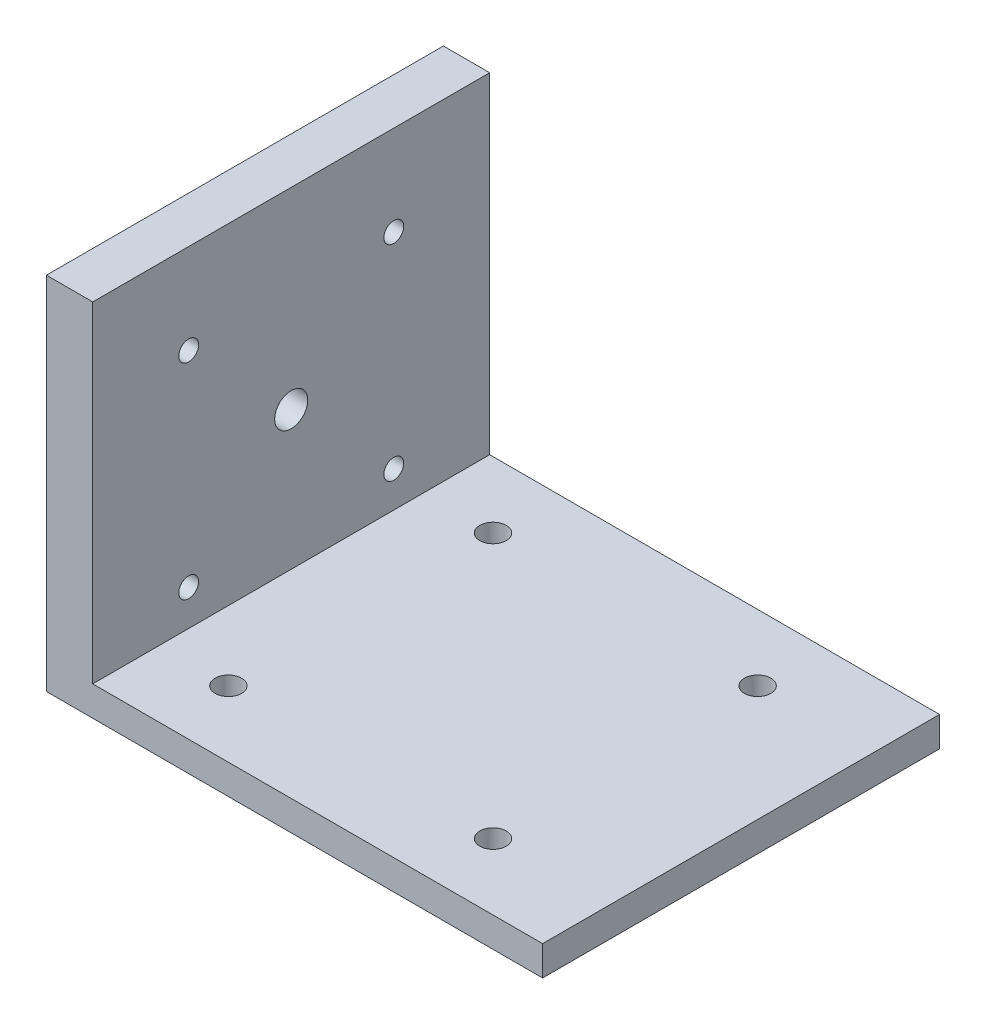
ISO-10303-21;
HEADER;
FILE_DESCRIPTION(('STEP AP214'),'2;1');
FILE_NAME('part.step','',(''),(''),'','','');
FILE_SCHEMA(('AUTOMOTIVE_DESIGN { 1 0 10303 214 1 1 1 1 }'));
ENDSEC;
DATA;
#1=APPLICATION_CONTEXT('core data for automotive mechanical design processes');
#2=APPLICATION_PROTOCOL_DEFINITION('international standard','automotive_design',2000,#1);
#3=PRODUCT_CONTEXT('',#1,'mechanical');
#4=PRODUCT('Part','Part','',(#3));
#5=PRODUCT_RELATED_PRODUCT_CATEGORY('part','',(#4));
#6=PRODUCT_DEFINITION_FORMATION('','',#4);
#7=PRODUCT_DEFINITION_CONTEXT('part definition',#1,'design');
#8=PRODUCT_DEFINITION('design','',#6,#7);
#9=PRODUCT_DEFINITION_SHAPE('','',#8);
#10=(LENGTH_UNIT() NAMED_UNIT(*) SI_UNIT(.MILLI.,.METRE.));
#11=(NAMED_UNIT(*) PLANE_ANGLE_UNIT() SI_UNIT($,.RADIAN.));
#12=(NAMED_UNIT(*) SI_UNIT($,.STERADIAN.) SOLID_ANGLE_UNIT());
#13=UNCERTAINTY_MEASURE_WITH_UNIT(LENGTH_MEASURE(1.E-05),#10,'distance_accuracy_value','');
#14=(GEOMETRIC_REPRESENTATION_CONTEXT(3) GLOBAL_UNCERTAINTY_ASSIGNED_CONTEXT((#13)) GLOBAL_UNIT_ASSIGNED_CONTEXT((#10,
#11,#12)) REPRESENTATION_CONTEXT('',''));
#15=CARTESIAN_POINT('',(0.,0.,0.));
#16=DIRECTION('',(0.,0.,1.));
#17=DIRECTION('',(1.,0.,0.));
#18=AXIS2_PLACEMENT_3D('',#15,#16,#17);
#19=CARTESIAN_POINT('',(37.5,4.5,-30.));
#20=DIRECTION('',(-1.,0.,0.));
#21=DIRECTION('',(0.,0.,1.));
#22=AXIS2_PLACEMENT_3D('',#19,#20,#21);
#23=PLANE('',#22);
#24=DIRECTION('',(0.,0.,-1.));
#25=VECTOR('',#24,1.);
#26=CARTESIAN_POINT('',(37.5,0.,-30.));
#27=LINE('',#26,#25);
#28=CARTESIAN_POINT('',(37.5,0.,30.));
#29=VERTEX_POINT('',#28);
#30=CARTESIAN_POINT('',(37.5,0.,-30.));
#31=VERTEX_POINT('',#30);
#32=EDGE_CURVE('E91',#29,#31,#27,.T.);
#33=ORIENTED_EDGE('',*,*,#32,.T.);
#34=DIRECTION('',(0.,-1.,0.));
#35=VECTOR('',#34,1.);
#36=CARTESIAN_POINT('',(37.5,4.5,-30.));
#37=LINE('',#36,#35);
#38=CARTESIAN_POINT('',(37.5,4.5,-30.));
#39=VERTEX_POINT('',#38);
#40=EDGE_CURVE('E11',#39,#31,#37,.T.);
#41=ORIENTED_EDGE('',*,*,#40,.F.);
#42=DIRECTION('',(0.,0.,-1.));
#43=VECTOR('',#42,1.);
#44=CARTESIAN_POINT('',(37.5,4.5,-30.));
#45=LINE('',#44,#43);
#46=CARTESIAN_POINT('',(37.5,4.5,30.));
#47=VERTEX_POINT('',#46);
#48=EDGE_CURVE('E85',#47,#39,#45,.T.);
#49=ORIENTED_EDGE('',*,*,#48,.F.);
#50=DIRECTION('',(0.,-1.,0.));
#51=VECTOR('',#50,1.);
#52=CARTESIAN_POINT('',(37.5,4.5,30.));
#53=LINE('',#52,#51);
#54=EDGE_CURVE('E77',#47,#29,#53,.T.);
#55=ORIENTED_EDGE('',*,*,#54,.T.);
#56=EDGE_LOOP('',(#33,#41,#49,#55));
#57=FACE_BOUND('',#56,.T.);
#58=ADVANCED_FACE('F33',(#57),#23,.F.);
#59=CARTESIAN_POINT('',(-37.5,4.5,-30.));
#60=DIRECTION('',(0.,0.,1.));
#61=DIRECTION('',(1.,0.,0.));
#62=AXIS2_PLACEMENT_3D('',#59,#60,#61);
#63=PLANE('',#62);
#64=DIRECTION('',(-1.,0.,0.));
#65=VECTOR('',#64,1.);
#66=CARTESIAN_POINT('',(-37.5,0.,-30.));
#67=LINE('',#66,#65);
#68=CARTESIAN_POINT('',(-37.5,0.,-30.));
#69=VERTEX_POINT('',#68);
#70=EDGE_CURVE('E94',#31,#69,#67,.T.);
#71=ORIENTED_EDGE('',*,*,#70,.T.);
#72=DIRECTION('',(0.,-1.,0.));
#73=VECTOR('',#72,1.);
#74=CARTESIAN_POINT('',(-37.5,4.5,-30.));
#75=LINE('',#74,#73);
#76=CARTESIAN_POINT('',(-37.5,54.5,-30.));
#77=VERTEX_POINT('',#76);
#78=EDGE_CURVE('E41',#77,#69,#75,.T.);
#79=ORIENTED_EDGE('',*,*,#78,.F.);
#80=DIRECTION('',(-1.,0.,0.));
#81=VECTOR('',#80,1.);
#82=CARTESIAN_POINT('',(-37.5,54.5,-30.));
#83=LINE('',#82,#81);
#84=CARTESIAN_POINT('',(-30.5,54.5,-30.));
#85=VERTEX_POINT('',#84);
#86=EDGE_CURVE('E154',#85,#77,#83,.T.);
#87=ORIENTED_EDGE('',*,*,#86,.F.);
#88=DIRECTION('',(0.,-1.,0.));
#89=VECTOR('',#88,1.);
#90=CARTESIAN_POINT('',(-30.5,54.5,-30.));
#91=LINE('',#90,#89);
#92=CARTESIAN_POINT('',(-30.5,4.5,-30.));
#93=VERTEX_POINT('',#92);
#94=EDGE_CURVE('E95',#85,#93,#91,.T.);
#95=ORIENTED_EDGE('',*,*,#94,.T.);
#96=DIRECTION('',(-1.,0.,0.));
#97=VECTOR('',#96,1.);
#98=CARTESIAN_POINT('',(-37.5,4.5,-30.));
#99=LINE('',#98,#97);
#100=EDGE_CURVE('E166',#39,#93,#99,.T.);
#101=ORIENTED_EDGE('',*,*,#100,.F.);
#102=ORIENTED_EDGE('',*,*,#40,.T.);
#103=EDGE_LOOP('',(#71,#79,#87,#95,#101,#102));
#104=FACE_BOUND('',#103,.T.);
#105=ADVANCED_FACE('F173',(#104),#63,.F.);
#106=CARTESIAN_POINT('',(-37.5,4.5,-30.));
#107=DIRECTION('',(1.,0.,0.));
#108=DIRECTION('',(0.,0.,-1.));
#109=AXIS2_PLACEMENT_3D('',#106,#107,#108);
#110=PLANE('',#109);
#111=CARTESIAN_POINT('',(-37.5,25.4,0.));
#112=DIRECTION('',(-1.,0.,0.));
#113=DIRECTION('',(0.,0.,1.));
#114=AXIS2_PLACEMENT_3D('',#111,#112,#113);
#115=CIRCLE('',#114,2.5);
#116=CARTESIAN_POINT('',(-37.5,25.4,2.5));
#117=VERTEX_POINT('',#116);
#118=EDGE_CURVE('E135',#117,#117,#115,.T.);
#119=ORIENTED_EDGE('',*,*,#118,.F.);
#120=EDGE_LOOP('',(#119));
#121=FACE_BOUND('',#120,.T.);
#122=CARTESIAN_POINT('',(-37.5,9.9,-15.5));
#123=DIRECTION('',(-1.,0.,0.));
#124=DIRECTION('',(0.,0.,-1.));
#125=AXIS2_PLACEMENT_3D('',#122,#123,#124);
#126=CIRCLE('',#125,1.5);
#127=CARTESIAN_POINT('',(-37.5,9.9,-17.));
#128=VERTEX_POINT('',#127);
#129=EDGE_CURVE('E139',#128,#128,#126,.T.);
#130=ORIENTED_EDGE('',*,*,#129,.F.);
#131=EDGE_LOOP('',(#130));
#132=FACE_BOUND('',#131,.T.);
#133=CARTESIAN_POINT('',(-37.5,9.90000000000003,15.5));
#134=DIRECTION('',(-1.,0.,0.));
#135=DIRECTION('',(0.,0.,1.));
#136=AXIS2_PLACEMENT_3D('',#133,#134,#135);
#137=CIRCLE('',#136,1.5);
#138=CARTESIAN_POINT('',(-37.5,9.90000000000003,17.));
#139=VERTEX_POINT('',#138);
#140=EDGE_CURVE('E144',#139,#139,#137,.T.);
#141=ORIENTED_EDGE('',*,*,#140,.F.);
#142=EDGE_LOOP('',(#141));
#143=FACE_BOUND('',#142,.T.);
#144=CARTESIAN_POINT('',(-37.5,40.9,15.5));
#145=DIRECTION('',(-1.,0.,0.));
#146=DIRECTION('',(0.,0.,-1.));
#147=AXIS2_PLACEMENT_3D('',#144,#145,#146);
#148=CIRCLE('',#147,1.5);
#149=CARTESIAN_POINT('',(-37.5,40.9,14.));
#150=VERTEX_POINT('',#149);
#151=EDGE_CURVE('E150',#150,#150,#148,.T.);
#152=ORIENTED_EDGE('',*,*,#151,.F.);
#153=EDGE_LOOP('',(#152));
#154=FACE_BOUND('',#153,.T.);
#155=CARTESIAN_POINT('',(-37.5,40.9,-15.5));
#156=DIRECTION('',(-1.,0.,0.));
#157=DIRECTION('',(0.,0.,1.));
#158=AXIS2_PLACEMENT_3D('',#155,#156,#157);
#159=CIRCLE('',#158,1.5);
#160=CARTESIAN_POINT('',(-37.5,40.9,-14.));
#161=VERTEX_POINT('',#160);
#162=EDGE_CURVE('E112',#161,#161,#159,.T.);
#163=ORIENTED_EDGE('',*,*,#162,.F.);
#164=EDGE_LOOP('',(#163));
#165=FACE_BOUND('',#164,.T.);
#166=DIRECTION('',(0.,0.,1.));
#167=VECTOR('',#166,1.);
#168=CARTESIAN_POINT('',(-37.5,0.,-30.));
#169=LINE('',#168,#167);
#170=CARTESIAN_POINT('',(-37.5,0.,30.));
#171=VERTEX_POINT('',#170);
#172=EDGE_CURVE('E86',#69,#171,#169,.T.);
#173=ORIENTED_EDGE('',*,*,#172,.T.);
#174=DIRECTION('',(0.,-1.,0.));
#175=VECTOR('',#174,1.);
#176=CARTESIAN_POINT('',(-37.5,4.5,30.));
#177=LINE('',#176,#175);
#178=CARTESIAN_POINT('',(-37.5,54.5,30.));
#179=VERTEX_POINT('',#178);
#180=EDGE_CURVE('E81',#179,#171,#177,.T.);
#181=ORIENTED_EDGE('',*,*,#180,.F.);
#182=DIRECTION('',(0.,0.,1.));
#183=VECTOR('',#182,1.);
#184=CARTESIAN_POINT('',(-37.5,54.5,-30.));
#185=LINE('',#184,#183);
#186=EDGE_CURVE('E157',#77,#179,#185,.T.);
#187=ORIENTED_EDGE('',*,*,#186,.F.);
#188=ORIENTED_EDGE('',*,*,#78,.T.);
#189=EDGE_LOOP('',(#173,#181,#187,#188));
#190=FACE_BOUND('',#189,.T.);
#191=ADVANCED_FACE('F189',(#121,#132,#143,#154,#165,#190),#110,.F.);
#192=CARTESIAN_POINT('',(-37.5,4.5,30.));
#193=DIRECTION('',(0.,0.,-1.));
#194=DIRECTION('',(-1.,0.,0.));
#195=AXIS2_PLACEMENT_3D('',#192,#193,#194);
#196=PLANE('',#195);
#197=DIRECTION('',(1.,0.,0.));
#198=VECTOR('',#197,1.);
#199=CARTESIAN_POINT('',(-37.5,0.,30.));
#200=LINE('',#199,#198);
#201=EDGE_CURVE('E74',#171,#29,#200,.T.);
#202=ORIENTED_EDGE('',*,*,#201,.T.);
#203=ORIENTED_EDGE('',*,*,#54,.F.);
#204=DIRECTION('',(1.,0.,0.));
#205=VECTOR('',#204,1.);
#206=CARTESIAN_POINT('',(-37.5,4.5,30.));
#207=LINE('',#206,#205);
#208=CARTESIAN_POINT('',(-30.5,4.5,30.));
#209=VERTEX_POINT('',#208);
#210=EDGE_CURVE('E54',#209,#47,#207,.T.);
#211=ORIENTED_EDGE('',*,*,#210,.F.);
#212=DIRECTION('',(0.,-1.,0.));
#213=VECTOR('',#212,1.);
#214=CARTESIAN_POINT('',(-30.5,54.5,30.));
#215=LINE('',#214,#213);
#216=CARTESIAN_POINT('',(-30.5,54.5,30.));
#217=VERTEX_POINT('',#216);
#218=EDGE_CURVE('E99',#217,#209,#215,.T.);
#219=ORIENTED_EDGE('',*,*,#218,.F.);
#220=DIRECTION('',(1.,0.,0.));
#221=VECTOR('',#220,1.);
#222=CARTESIAN_POINT('',(-37.5,54.5,30.));
#223=LINE('',#222,#221);
#224=EDGE_CURVE('E160',#179,#217,#223,.T.);
#225=ORIENTED_EDGE('',*,*,#224,.F.);
#226=ORIENTED_EDGE('',*,*,#180,.T.);
#227=EDGE_LOOP('',(#202,#203,#211,#219,#225,#226));
#228=FACE_BOUND('',#227,.T.);
#229=ADVANCED_FACE('F76',(#228),#196,.F.);
#230=CARTESIAN_POINT('',(0.,4.5,0.));
#231=DIRECTION('',(0.,1.,0.));
#232=DIRECTION('',(0.,0.,1.));
#233=AXIS2_PLACEMENT_3D('',#230,#231,#232);
#234=PLANE('',#233);
#235=CARTESIAN_POINT('',(-20.,4.5,-20.));
#236=DIRECTION('',(0.,1.,0.));
#237=DIRECTION('',(0.,0.,-1.));
#238=AXIS2_PLACEMENT_3D('',#235,#236,#237);
#239=CIRCLE('',#238,2.);
#240=CARTESIAN_POINT('',(-20.,4.5,-22.));
#241=VERTEX_POINT('',#240);
#242=EDGE_CURVE('E349',#241,#241,#239,.T.);
#243=ORIENTED_EDGE('',*,*,#242,.F.);
#244=EDGE_LOOP('',(#243));
#245=FACE_BOUND('',#244,.T.);
#246=CARTESIAN_POINT('',(20.,4.5,20.));
#247=DIRECTION('',(0.,1.,0.));
#248=DIRECTION('',(0.,0.,-1.));
#249=AXIS2_PLACEMENT_3D('',#246,#247,#248);
#250=CIRCLE('',#249,2.);
#251=CARTESIAN_POINT('',(20.,4.5,18.));
#252=VERTEX_POINT('',#251);
#253=EDGE_CURVE('E350',#252,#252,#250,.T.);
#254=ORIENTED_EDGE('',*,*,#253,.F.);
#255=EDGE_LOOP('',(#254));
#256=FACE_BOUND('',#255,.T.);
#257=CARTESIAN_POINT('',(-20.,4.5,20.));
#258=DIRECTION('',(0.,1.,0.));
#259=DIRECTION('',(0.,0.,1.));
#260=AXIS2_PLACEMENT_3D('',#257,#258,#259);
#261=CIRCLE('',#260,2.);
#262=CARTESIAN_POINT('',(-20.,4.5,22.));
#263=VERTEX_POINT('',#262);
#264=EDGE_CURVE('E355',#263,#263,#261,.T.);
#265=ORIENTED_EDGE('',*,*,#264,.F.);
#266=EDGE_LOOP('',(#265));
#267=FACE_BOUND('',#266,.T.);
#268=CARTESIAN_POINT('',(20.,4.5,-20.));
#269=DIRECTION('',(0.,1.,0.));
#270=DIRECTION('',(0.,0.,1.));
#271=AXIS2_PLACEMENT_3D('',#268,#269,#270);
#272=CIRCLE('',#271,2.);
#273=CARTESIAN_POINT('',(20.,4.5,-18.));
#274=VERTEX_POINT('',#273);
#275=EDGE_CURVE('E128',#274,#274,#272,.T.);
#276=ORIENTED_EDGE('',*,*,#275,.F.);
#277=EDGE_LOOP('',(#276));
#278=FACE_BOUND('',#277,.T.);
#279=DIRECTION('',(0.,0.,-1.));
#280=VECTOR('',#279,1.);
#281=CARTESIAN_POINT('',(-30.5,4.5,-30.));
#282=LINE('',#281,#280);
#283=EDGE_CURVE('E49',#209,#93,#282,.T.);
#284=ORIENTED_EDGE('',*,*,#283,.F.);
#285=ORIENTED_EDGE('',*,*,#210,.T.);
#286=ORIENTED_EDGE('',*,*,#48,.T.);
#287=ORIENTED_EDGE('',*,*,#100,.T.);
#288=EDGE_LOOP('',(#284,#285,#286,#287));
#289=FACE_BOUND('',#288,.T.);
#290=ADVANCED_FACE('F168',(#245,#256,#267,#278,#289),#234,.T.);
#291=CARTESIAN_POINT('',(0.,0.,0.));
#292=DIRECTION('',(0.,1.,0.));
#293=DIRECTION('',(0.,0.,1.));
#294=AXIS2_PLACEMENT_3D('',#291,#292,#293);
#295=PLANE('',#294);
#296=CARTESIAN_POINT('',(-20.,0.,-20.));
#297=DIRECTION('',(0.,1.,0.));
#298=DIRECTION('',(0.,0.,1.));
#299=AXIS2_PLACEMENT_3D('',#296,#297,#298);
#300=CIRCLE('',#299,2.);
#301=CARTESIAN_POINT('',(-20.,0.,-18.));
#302=VERTEX_POINT('',#301);
#303=EDGE_CURVE('E36',#302,#302,#300,.T.);
#304=ORIENTED_EDGE('',*,*,#303,.T.);
#305=EDGE_LOOP('',(#304));
#306=FACE_BOUND('',#305,.T.);
#307=CARTESIAN_POINT('',(20.,0.,20.));
#308=DIRECTION('',(0.,1.,0.));
#309=DIRECTION('',(0.,0.,1.));
#310=AXIS2_PLACEMENT_3D('',#307,#308,#309);
#311=CIRCLE('',#310,2.);
#312=CARTESIAN_POINT('',(20.,0.,22.));
#313=VERTEX_POINT('',#312);
#314=EDGE_CURVE('E130',#313,#313,#311,.T.);
#315=ORIENTED_EDGE('',*,*,#314,.T.);
#316=EDGE_LOOP('',(#315));
#317=FACE_BOUND('',#316,.T.);
#318=CARTESIAN_POINT('',(-20.,0.,20.));
#319=DIRECTION('',(0.,1.,0.));
#320=DIRECTION('',(0.,0.,1.));
#321=AXIS2_PLACEMENT_3D('',#318,#319,#320);
#322=CIRCLE('',#321,2.);
#323=CARTESIAN_POINT('',(-20.,0.,22.));
#324=VERTEX_POINT('',#323);
#325=EDGE_CURVE('E127',#324,#324,#322,.T.);
#326=ORIENTED_EDGE('',*,*,#325,.T.);
#327=EDGE_LOOP('',(#326));
#328=FACE_BOUND('',#327,.T.);
#329=CARTESIAN_POINT('',(20.,0.,-20.));
#330=DIRECTION('',(0.,1.,0.));
#331=DIRECTION('',(0.,0.,1.));
#332=AXIS2_PLACEMENT_3D('',#329,#330,#331);
#333=CIRCLE('',#332,2.);
#334=CARTESIAN_POINT('',(20.,0.,-18.));
#335=VERTEX_POINT('',#334);
#336=EDGE_CURVE('E124',#335,#335,#333,.T.);
#337=ORIENTED_EDGE('',*,*,#336,.T.);
#338=EDGE_LOOP('',(#337));
#339=FACE_BOUND('',#338,.T.);
#340=ORIENTED_EDGE('',*,*,#32,.F.);
#341=ORIENTED_EDGE('',*,*,#201,.F.);
#342=ORIENTED_EDGE('',*,*,#172,.F.);
#343=ORIENTED_EDGE('',*,*,#70,.F.);
#344=EDGE_LOOP('',(#340,#341,#342,#343));
#345=FACE_BOUND('',#344,.T.);
#346=ADVANCED_FACE('F93',(#306,#317,#328,#339,#345),#295,.F.);
#347=CARTESIAN_POINT('',(-30.5,54.5,-30.));
#348=DIRECTION('',(-1.,0.,0.));
#349=DIRECTION('',(0.,0.,1.));
#350=AXIS2_PLACEMENT_3D('',#347,#348,#349);
#351=PLANE('',#350);
#352=CARTESIAN_POINT('',(-30.5,25.4,0.));
#353=DIRECTION('',(-1.,0.,0.));
#354=DIRECTION('',(0.,0.,1.));
#355=AXIS2_PLACEMENT_3D('',#352,#353,#354);
#356=CIRCLE('',#355,2.5);
#357=CARTESIAN_POINT('',(-30.5,25.4,2.5));
#358=VERTEX_POINT('',#357);
#359=EDGE_CURVE('E121',#358,#358,#356,.T.);
#360=ORIENTED_EDGE('',*,*,#359,.T.);
#361=EDGE_LOOP('',(#360));
#362=FACE_BOUND('',#361,.T.);
#363=CARTESIAN_POINT('',(-30.5,9.9,-15.5));
#364=DIRECTION('',(-1.,0.,0.));
#365=DIRECTION('',(0.,0.,1.));
#366=AXIS2_PLACEMENT_3D('',#363,#364,#365);
#367=CIRCLE('',#366,1.5);
#368=CARTESIAN_POINT('',(-30.5,9.9,-14.));
#369=VERTEX_POINT('',#368);
#370=EDGE_CURVE('E118',#369,#369,#367,.T.);
#371=ORIENTED_EDGE('',*,*,#370,.T.);
#372=EDGE_LOOP('',(#371));
#373=FACE_BOUND('',#372,.T.);
#374=CARTESIAN_POINT('',(-30.5,9.90000000000003,15.5));
#375=DIRECTION('',(-1.,0.,0.));
#376=DIRECTION('',(0.,0.,1.));
#377=AXIS2_PLACEMENT_3D('',#374,#375,#376);
#378=CIRCLE('',#377,1.5);
#379=CARTESIAN_POINT('',(-30.5,9.90000000000003,17.));
#380=VERTEX_POINT('',#379);
#381=EDGE_CURVE('E115',#380,#380,#378,.T.);
#382=ORIENTED_EDGE('',*,*,#381,.T.);
#383=EDGE_LOOP('',(#382));
#384=FACE_BOUND('',#383,.T.);
#385=CARTESIAN_POINT('',(-30.5,40.9,15.5));
#386=DIRECTION('',(-1.,0.,0.));
#387=DIRECTION('',(0.,0.,1.));
#388=AXIS2_PLACEMENT_3D('',#385,#386,#387);
#389=CIRCLE('',#388,1.5);
#390=CARTESIAN_POINT('',(-30.5,40.9,17.));
#391=VERTEX_POINT('',#390);
#392=EDGE_CURVE('E111',#391,#391,#389,.T.);
#393=ORIENTED_EDGE('',*,*,#392,.T.);
#394=EDGE_LOOP('',(#393));
#395=FACE_BOUND('',#394,.T.);
#396=CARTESIAN_POINT('',(-30.5,40.9,-15.5));
#397=DIRECTION('',(-1.,0.,0.));
#398=DIRECTION('',(0.,0.,1.));
#399=AXIS2_PLACEMENT_3D('',#396,#397,#398);
#400=CIRCLE('',#399,1.5);
#401=CARTESIAN_POINT('',(-30.5,40.9,-14.));
#402=VERTEX_POINT('',#401);
#403=EDGE_CURVE('E108',#402,#402,#400,.T.);
#404=ORIENTED_EDGE('',*,*,#403,.T.);
#405=EDGE_LOOP('',(#404));
#406=FACE_BOUND('',#405,.T.);
#407=ORIENTED_EDGE('',*,*,#283,.T.);
#408=ORIENTED_EDGE('',*,*,#94,.F.);
#409=DIRECTION('',(0.,0.,-1.));
#410=VECTOR('',#409,1.);
#411=CARTESIAN_POINT('',(-30.5,54.5,-30.));
#412=LINE('',#411,#410);
#413=EDGE_CURVE('E151',#217,#85,#412,.T.);
#414=ORIENTED_EDGE('',*,*,#413,.F.);
#415=ORIENTED_EDGE('',*,*,#218,.T.);
#416=EDGE_LOOP('',(#407,#408,#414,#415));
#417=FACE_BOUND('',#416,.T.);
#418=ADVANCED_FACE('F177',(#362,#373,#384,#395,#406,#417),#351,.F.);
#419=CARTESIAN_POINT('',(0.,54.5,0.));
#420=DIRECTION('',(0.,1.,0.));
#421=DIRECTION('',(0.,0.,1.));
#422=AXIS2_PLACEMENT_3D('',#419,#420,#421);
#423=PLANE('',#422);
#424=ORIENTED_EDGE('',*,*,#413,.T.);
#425=ORIENTED_EDGE('',*,*,#86,.T.);
#426=ORIENTED_EDGE('',*,*,#186,.T.);
#427=ORIENTED_EDGE('',*,*,#224,.T.);
#428=EDGE_LOOP('',(#424,#425,#426,#427));
#429=FACE_BOUND('',#428,.T.);
#430=ADVANCED_FACE('F188',(#429),#423,.T.);
#431=CARTESIAN_POINT('',(-27.5,40.9,-15.5));
#432=DIRECTION('',(-1.,0.,0.));
#433=DIRECTION('',(0.,0.,1.));
#434=AXIS2_PLACEMENT_3D('',#431,#432,#433);
#435=CYLINDRICAL_SURFACE('',#434,1.5);
#436=ORIENTED_EDGE('',*,*,#162,.T.);
#437=EDGE_LOOP('',(#436));
#438=FACE_BOUND('',#437,.T.);
#439=ORIENTED_EDGE('',*,*,#403,.F.);
#440=EDGE_LOOP('',(#439));
#441=FACE_BOUND('',#440,.T.);
#442=ADVANCED_FACE('F226',(#438,#441),#435,.F.);
#443=CARTESIAN_POINT('',(-27.5,40.9,15.5));
#444=DIRECTION('',(-1.,0.,0.));
#445=DIRECTION('',(0.,0.,1.));
#446=AXIS2_PLACEMENT_3D('',#443,#444,#445);
#447=CYLINDRICAL_SURFACE('',#446,1.5);
#448=ORIENTED_EDGE('',*,*,#151,.T.);
#449=EDGE_LOOP('',(#448));
#450=FACE_BOUND('',#449,.T.);
#451=ORIENTED_EDGE('',*,*,#392,.F.);
#452=EDGE_LOOP('',(#451));
#453=FACE_BOUND('',#452,.T.);
#454=ADVANCED_FACE('F249',(#450,#453),#447,.F.);
#455=CARTESIAN_POINT('',(-27.5,9.90000000000003,15.5));
#456=DIRECTION('',(-1.,0.,0.));
#457=DIRECTION('',(0.,0.,1.));
#458=AXIS2_PLACEMENT_3D('',#455,#456,#457);
#459=CYLINDRICAL_SURFACE('',#458,1.5);
#460=ORIENTED_EDGE('',*,*,#140,.T.);
#461=EDGE_LOOP('',(#460));
#462=FACE_BOUND('',#461,.T.);
#463=ORIENTED_EDGE('',*,*,#381,.F.);
#464=EDGE_LOOP('',(#463));
#465=FACE_BOUND('',#464,.T.);
#466=ADVANCED_FACE('F259',(#462,#465),#459,.F.);
#467=CARTESIAN_POINT('',(-27.5,9.9,-15.5));
#468=DIRECTION('',(-1.,0.,0.));
#469=DIRECTION('',(0.,0.,1.));
#470=AXIS2_PLACEMENT_3D('',#467,#468,#469);
#471=CYLINDRICAL_SURFACE('',#470,1.5);
#472=ORIENTED_EDGE('',*,*,#129,.T.);
#473=EDGE_LOOP('',(#472));
#474=FACE_BOUND('',#473,.T.);
#475=ORIENTED_EDGE('',*,*,#370,.F.);
#476=EDGE_LOOP('',(#475));
#477=FACE_BOUND('',#476,.T.);
#478=ADVANCED_FACE('F269',(#474,#477),#471,.F.);
#479=CARTESIAN_POINT('',(-27.5,25.4,0.));
#480=DIRECTION('',(-1.,0.,0.));
#481=DIRECTION('',(0.,0.,1.));
#482=AXIS2_PLACEMENT_3D('',#479,#480,#481);
#483=CYLINDRICAL_SURFACE('',#482,2.5);
#484=ORIENTED_EDGE('',*,*,#118,.T.);
#485=EDGE_LOOP('',(#484));
#486=FACE_BOUND('',#485,.T.);
#487=ORIENTED_EDGE('',*,*,#359,.F.);
#488=EDGE_LOOP('',(#487));
#489=FACE_BOUND('',#488,.T.);
#490=ADVANCED_FACE('F279',(#486,#489),#483,.F.);
#491=CARTESIAN_POINT('',(20.,-5.5,-20.));
#492=DIRECTION('',(0.,1.,0.));
#493=DIRECTION('',(0.,0.,1.));
#494=AXIS2_PLACEMENT_3D('',#491,#492,#493);
#495=CYLINDRICAL_SURFACE('',#494,2.);
#496=ORIENTED_EDGE('',*,*,#275,.T.);
#497=EDGE_LOOP('',(#496));
#498=FACE_BOUND('',#497,.T.);
#499=ORIENTED_EDGE('',*,*,#336,.F.);
#500=EDGE_LOOP('',(#499));
#501=FACE_BOUND('',#500,.T.);
#502=ADVANCED_FACE('F289',(#498,#501),#495,.F.);
#503=CARTESIAN_POINT('',(-20.,-5.5,20.));
#504=DIRECTION('',(0.,1.,0.));
#505=DIRECTION('',(0.,0.,1.));
#506=AXIS2_PLACEMENT_3D('',#503,#504,#505);
#507=CYLINDRICAL_SURFACE('',#506,2.);
#508=ORIENTED_EDGE('',*,*,#264,.T.);
#509=EDGE_LOOP('',(#508));
#510=FACE_BOUND('',#509,.T.);
#511=ORIENTED_EDGE('',*,*,#325,.F.);
#512=EDGE_LOOP('',(#511));
#513=FACE_BOUND('',#512,.T.);
#514=ADVANCED_FACE('F312',(#510,#513),#507,.F.);
#515=CARTESIAN_POINT('',(20.,-5.5,20.));
#516=DIRECTION('',(0.,1.,0.));
#517=DIRECTION('',(0.,0.,1.));
#518=AXIS2_PLACEMENT_3D('',#515,#516,#517);
#519=CYLINDRICAL_SURFACE('',#518,2.);
#520=ORIENTED_EDGE('',*,*,#253,.T.);
#521=EDGE_LOOP('',(#520));
#522=FACE_BOUND('',#521,.T.);
#523=ORIENTED_EDGE('',*,*,#314,.F.);
#524=EDGE_LOOP('',(#523));
#525=FACE_BOUND('',#524,.T.);
#526=ADVANCED_FACE('F322',(#522,#525),#519,.F.);
#527=CARTESIAN_POINT('',(-20.,-5.5,-20.));
#528=DIRECTION('',(0.,1.,0.));
#529=DIRECTION('',(0.,0.,1.));
#530=AXIS2_PLACEMENT_3D('',#527,#528,#529);
#531=CYLINDRICAL_SURFACE('',#530,2.);
#532=ORIENTED_EDGE('',*,*,#242,.T.);
#533=EDGE_LOOP('',(#532));
#534=FACE_BOUND('',#533,.T.);
#535=ORIENTED_EDGE('',*,*,#303,.F.);
#536=EDGE_LOOP('',(#535));
#537=FACE_BOUND('',#536,.T.);
#538=ADVANCED_FACE('F332',(#534,#537),#531,.F.);
#539=CLOSED_SHELL('',(#58,#105,#191,#229,#290,#346,#418,#430,#442,#454,#466,#478,#490,#502,#514,
#526,#538));
#540=MANIFOLD_SOLID_BREP('B2',#539);
#541=ADVANCED_BREP_SHAPE_REPRESENTATION('',(#18,#540),#14);
#542=SHAPE_DEFINITION_REPRESENTATION(#9,#541);
ENDSEC;
END-ISO-10303-21;
